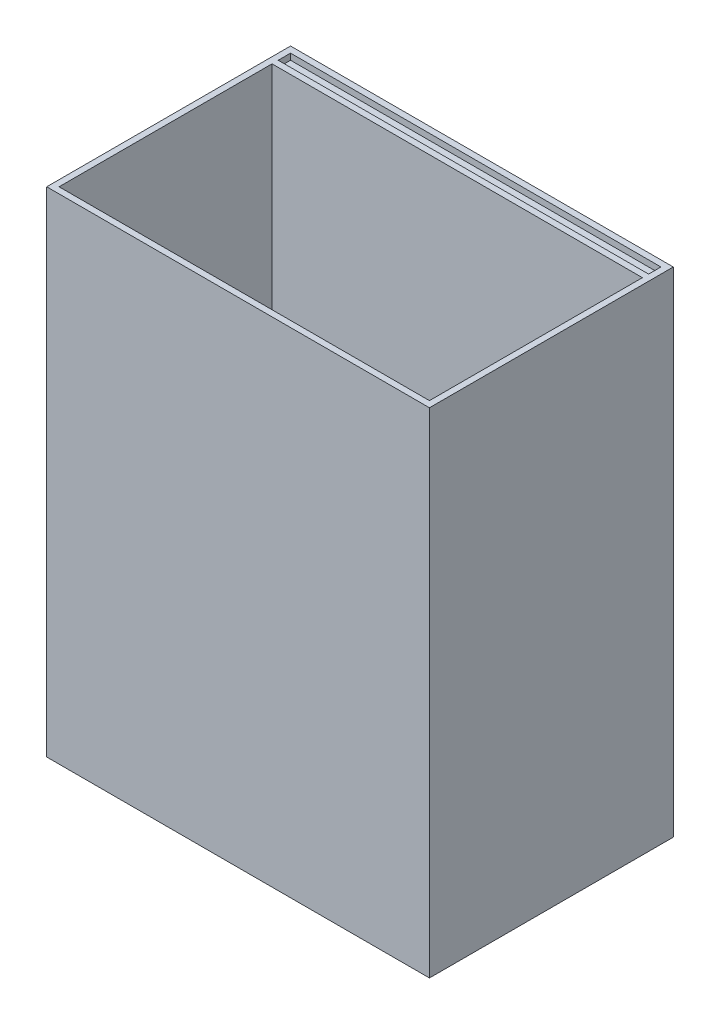
ISO-10303-21;
HEADER;
FILE_DESCRIPTION(('STEP AP214'),'2;1');
FILE_NAME('part.step','',(''),(''),'','','');
FILE_SCHEMA(('AUTOMOTIVE_DESIGN { 1 0 10303 214 1 1 1 1 }'));
ENDSEC;
DATA;
#1=APPLICATION_CONTEXT('core data for automotive mechanical design processes');
#2=APPLICATION_PROTOCOL_DEFINITION('international standard','automotive_design',2000,#1);
#3=PRODUCT_CONTEXT('',#1,'mechanical');
#4=PRODUCT('Part','Part','',(#3));
#5=PRODUCT_RELATED_PRODUCT_CATEGORY('part','',(#4));
#6=PRODUCT_DEFINITION_FORMATION('','',#4);
#7=PRODUCT_DEFINITION_CONTEXT('part definition',#1,'design');
#8=PRODUCT_DEFINITION('design','',#6,#7);
#9=PRODUCT_DEFINITION_SHAPE('','',#8);
#10=(LENGTH_UNIT() NAMED_UNIT(*) SI_UNIT(.MILLI.,.METRE.));
#11=(NAMED_UNIT(*) PLANE_ANGLE_UNIT() SI_UNIT($,.RADIAN.));
#12=(NAMED_UNIT(*) SI_UNIT($,.STERADIAN.) SOLID_ANGLE_UNIT());
#13=UNCERTAINTY_MEASURE_WITH_UNIT(LENGTH_MEASURE(1.E-05),#10,'distance_accuracy_value','');
#14=(GEOMETRIC_REPRESENTATION_CONTEXT(3) GLOBAL_UNCERTAINTY_ASSIGNED_CONTEXT((#13)) GLOBAL_UNIT_ASSIGNED_CONTEXT((#10,
#11,#12)) REPRESENTATION_CONTEXT('',''));
#15=CARTESIAN_POINT('',(0.,0.,0.));
#16=DIRECTION('',(0.,0.,1.));
#17=DIRECTION('',(1.,0.,0.));
#18=AXIS2_PLACEMENT_3D('',#15,#16,#17);
#19=CARTESIAN_POINT('',(6100.,0.,0.));
#20=DIRECTION('',(-1.,0.,0.));
#21=DIRECTION('',(0.,0.,1.));
#22=AXIS2_PLACEMENT_3D('',#19,#20,#21);
#23=PLANE('',#22);
#24=DIRECTION('',(0.,0.,-1.));
#25=VECTOR('',#24,1.);
#26=CARTESIAN_POINT('',(6100.,7900.,0.));
#27=LINE('',#26,#25);
#28=CARTESIAN_POINT('',(6100.,7900.,300.));
#29=VERTEX_POINT('',#28);
#30=CARTESIAN_POINT('',(6100.,7900.,100.));
#31=VERTEX_POINT('',#30);
#32=EDGE_CURVE('E370',#29,#31,#27,.T.);
#33=ORIENTED_EDGE('',*,*,#32,.F.);
#34=DIRECTION('',(0.,-1.,0.));
#35=VECTOR('',#34,1.);
#36=CARTESIAN_POINT('',(6100.,1600.,300.));
#37=LINE('',#36,#35);
#38=CARTESIAN_POINT('',(6100.,8000.,300.));
#39=VERTEX_POINT('',#38);
#40=EDGE_CURVE('E292',#39,#29,#37,.T.);
#41=ORIENTED_EDGE('',*,*,#40,.F.);
#42=DIRECTION('',(0.,0.,1.));
#43=VECTOR('',#42,1.);
#44=CARTESIAN_POINT('',(6100.,8000.,3850.));
#45=LINE('',#44,#43);
#46=CARTESIAN_POINT('',(6100.,8000.,100.));
#47=VERTEX_POINT('',#46);
#48=EDGE_CURVE('E485',#47,#39,#45,.T.);
#49=ORIENTED_EDGE('',*,*,#48,.F.);
#50=DIRECTION('',(0.,1.,0.));
#51=VECTOR('',#50,1.);
#52=CARTESIAN_POINT('',(6100.,100.,100.));
#53=LINE('',#52,#51);
#54=EDGE_CURVE('E478',#31,#47,#53,.T.);
#55=ORIENTED_EDGE('',*,*,#54,.F.);
#56=EDGE_LOOP('',(#33,#41,#49,#55));
#57=FACE_BOUND('',#56,.T.);
#58=ADVANCED_FACE('F43',(#57),#23,.T.);
#59=CARTESIAN_POINT('',(100.,0.,0.));
#60=DIRECTION('',(1.,0.,0.));
#61=DIRECTION('',(0.,0.,-1.));
#62=AXIS2_PLACEMENT_3D('',#59,#60,#61);
#63=PLANE('',#62);
#64=DIRECTION('',(0.,0.,1.));
#65=VECTOR('',#64,1.);
#66=CARTESIAN_POINT('',(100.,7900.,0.));
#67=LINE('',#66,#65);
#68=CARTESIAN_POINT('',(100.,7900.,100.));
#69=VERTEX_POINT('',#68);
#70=CARTESIAN_POINT('',(100.,7900.,300.));
#71=VERTEX_POINT('',#70);
#72=EDGE_CURVE('E366',#69,#71,#67,.T.);
#73=ORIENTED_EDGE('',*,*,#72,.F.);
#74=DIRECTION('',(0.,-1.,0.));
#75=VECTOR('',#74,1.);
#76=CARTESIAN_POINT('',(100.,100.,100.));
#77=LINE('',#76,#75);
#78=CARTESIAN_POINT('',(100.,8000.,100.));
#79=VERTEX_POINT('',#78);
#80=EDGE_CURVE('E447',#79,#69,#77,.T.);
#81=ORIENTED_EDGE('',*,*,#80,.F.);
#82=DIRECTION('',(0.,0.,-1.));
#83=VECTOR('',#82,1.);
#84=CARTESIAN_POINT('',(100.,8000.,100.));
#85=LINE('',#84,#83);
#86=CARTESIAN_POINT('',(100.,8000.,300.));
#87=VERTEX_POINT('',#86);
#88=EDGE_CURVE('E463',#87,#79,#85,.T.);
#89=ORIENTED_EDGE('',*,*,#88,.F.);
#90=DIRECTION('',(0.,1.,0.));
#91=VECTOR('',#90,1.);
#92=CARTESIAN_POINT('',(100.,0.,300.));
#93=LINE('',#92,#91);
#94=EDGE_CURVE('E549',#71,#87,#93,.T.);
#95=ORIENTED_EDGE('',*,*,#94,.F.);
#96=EDGE_LOOP('',(#73,#81,#89,#95));
#97=FACE_BOUND('',#96,.T.);
#98=ADVANCED_FACE('F635',(#97),#63,.T.);
#99=CARTESIAN_POINT('',(0.,0.,100.));
#100=DIRECTION('',(0.,0.,-1.));
#101=DIRECTION('',(-1.,0.,0.));
#102=AXIS2_PLACEMENT_3D('',#99,#100,#101);
#103=PLANE('',#102);
#104=ORIENTED_EDGE('',*,*,#80,.T.);
#105=DIRECTION('',(1.,0.,0.));
#106=VECTOR('',#105,1.);
#107=CARTESIAN_POINT('',(0.,7900.,100.));
#108=LINE('',#107,#106);
#109=EDGE_CURVE('E363',#69,#31,#108,.T.);
#110=ORIENTED_EDGE('',*,*,#109,.T.);
#111=ORIENTED_EDGE('',*,*,#54,.T.);
#112=DIRECTION('',(-1.,0.,0.));
#113=VECTOR('',#112,1.);
#114=CARTESIAN_POINT('',(0.,8000.,100.));
#115=LINE('',#114,#113);
#116=EDGE_CURVE('E514',#47,#79,#115,.T.);
#117=ORIENTED_EDGE('',*,*,#116,.T.);
#118=EDGE_LOOP('',(#104,#110,#111,#117));
#119=FACE_BOUND('',#118,.T.);
#120=ADVANCED_FACE('F624',(#119),#103,.F.);
#121=CARTESIAN_POINT('',(0.,0.,300.));
#122=DIRECTION('',(0.,0.,-1.));
#123=DIRECTION('',(-1.,0.,0.));
#124=AXIS2_PLACEMENT_3D('',#121,#122,#123);
#125=PLANE('',#124);
#126=DIRECTION('',(1.,0.,0.));
#127=VECTOR('',#126,1.);
#128=CARTESIAN_POINT('',(0.,7900.,300.));
#129=LINE('',#128,#127);
#130=EDGE_CURVE('E581',#71,#29,#129,.T.);
#131=ORIENTED_EDGE('',*,*,#130,.F.);
#132=ORIENTED_EDGE('',*,*,#94,.T.);
#133=DIRECTION('',(-1.,0.,0.));
#134=VECTOR('',#133,1.);
#135=CARTESIAN_POINT('',(100.,8000.,300.));
#136=LINE('',#135,#134);
#137=EDGE_CURVE('E419',#39,#87,#136,.T.);
#138=ORIENTED_EDGE('',*,*,#137,.F.);
#139=ORIENTED_EDGE('',*,*,#40,.T.);
#140=EDGE_LOOP('',(#131,#132,#138,#139));
#141=FACE_BOUND('',#140,.T.);
#142=ADVANCED_FACE('F638',(#141),#125,.T.);
#143=CARTESIAN_POINT('',(6100.,8000.,400.));
#144=VERTEX_POINT('',#143);
#145=CARTESIAN_POINT('',(6100.,8000.,3850.));
#146=VERTEX_POINT('',#145);
#147=EDGE_CURVE('E483',#144,#146,#45,.T.);
#148=ORIENTED_EDGE('',*,*,#147,.F.);
#149=DIRECTION('',(0.,-1.,0.));
#150=VECTOR('',#149,1.);
#151=CARTESIAN_POINT('',(6100.,8000.,400.));
#152=LINE('',#151,#150);
#153=CARTESIAN_POINT('',(6100.,1600.,400.));
#154=VERTEX_POINT('',#153);
#155=EDGE_CURVE('E423',#144,#154,#152,.T.);
#156=ORIENTED_EDGE('',*,*,#155,.T.);
#157=DIRECTION('',(0.,0.,1.));
#158=VECTOR('',#157,1.);
#159=CARTESIAN_POINT('',(6100.,1600.,300.));
#160=LINE('',#159,#158);
#161=CARTESIAN_POINT('',(6100.,1600.,3850.));
#162=VERTEX_POINT('',#161);
#163=EDGE_CURVE('E309',#154,#162,#160,.T.);
#164=ORIENTED_EDGE('',*,*,#163,.T.);
#165=DIRECTION('',(0.,-1.,0.));
#166=VECTOR('',#165,1.);
#167=CARTESIAN_POINT('',(6100.,100.,3850.));
#168=LINE('',#167,#166);
#169=EDGE_CURVE('E469',#146,#162,#168,.T.);
#170=ORIENTED_EDGE('',*,*,#169,.F.);
#171=EDGE_LOOP('',(#148,#156,#164,#170));
#172=FACE_BOUND('',#171,.T.);
#173=ADVANCED_FACE('F747',(#172),#23,.T.);
#174=DIRECTION('',(0.,0.,-1.));
#175=VECTOR('',#174,1.);
#176=CARTESIAN_POINT('',(100.,1600.,0.));
#177=LINE('',#176,#175);
#178=CARTESIAN_POINT('',(100.,1600.,3850.));
#179=VERTEX_POINT('',#178);
#180=CARTESIAN_POINT('',(99.9999999999997,1600.,400.));
#181=VERTEX_POINT('',#180);
#182=EDGE_CURVE('E552',#179,#181,#177,.T.);
#183=ORIENTED_EDGE('',*,*,#182,.T.);
#184=DIRECTION('',(0.,-1.,0.));
#185=VECTOR('',#184,1.);
#186=CARTESIAN_POINT('',(100.,8000.,400.));
#187=LINE('',#186,#185);
#188=CARTESIAN_POINT('',(100.,8000.,400.));
#189=VERTEX_POINT('',#188);
#190=EDGE_CURVE('E428',#189,#181,#187,.T.);
#191=ORIENTED_EDGE('',*,*,#190,.F.);
#192=CARTESIAN_POINT('',(100.,8000.,3850.));
#193=VERTEX_POINT('',#192);
#194=EDGE_CURVE('E464',#193,#189,#85,.T.);
#195=ORIENTED_EDGE('',*,*,#194,.F.);
#196=DIRECTION('',(0.,1.,0.));
#197=VECTOR('',#196,1.);
#198=CARTESIAN_POINT('',(100.,100.,3850.));
#199=LINE('',#198,#197);
#200=EDGE_CURVE('E457',#179,#193,#199,.T.);
#201=ORIENTED_EDGE('',*,*,#200,.F.);
#202=EDGE_LOOP('',(#183,#191,#195,#201));
#203=FACE_BOUND('',#202,.T.);
#204=ADVANCED_FACE('F740',(#203),#63,.T.);
#205=CARTESIAN_POINT('',(6100.,1600.,300.));
#206=DIRECTION('',(0.,-1.,0.));
#207=DIRECTION('',(1.,0.,0.));
#208=AXIS2_PLACEMENT_3D('',#205,#206,#207);
#209=PLANE('',#208);
#210=DIRECTION('',(1.,0.,0.));
#211=VECTOR('',#210,1.);
#212=CARTESIAN_POINT('',(99.9999999999997,1600.,400.));
#213=LINE('',#212,#211);
#214=EDGE_CURVE('E415',#181,#154,#213,.T.);
#215=ORIENTED_EDGE('',*,*,#214,.F.);
#216=ORIENTED_EDGE('',*,*,#182,.F.);
#217=DIRECTION('',(1.,0.,0.));
#218=VECTOR('',#217,1.);
#219=CARTESIAN_POINT('',(6100.,1600.,3850.));
#220=LINE('',#219,#218);
#221=EDGE_CURVE('E290',#179,#162,#220,.T.);
#222=ORIENTED_EDGE('',*,*,#221,.T.);
#223=ORIENTED_EDGE('',*,*,#163,.F.);
#224=EDGE_LOOP('',(#215,#216,#222,#223));
#225=FACE_BOUND('',#224,.T.);
#226=ADVANCED_FACE('F732',(#225),#209,.F.);
#227=CARTESIAN_POINT('',(0.,0.,3850.));
#228=DIRECTION('',(0.,0.,-1.));
#229=DIRECTION('',(-1.,0.,0.));
#230=AXIS2_PLACEMENT_3D('',#227,#228,#229);
#231=PLANE('',#230);
#232=ORIENTED_EDGE('',*,*,#169,.T.);
#233=ORIENTED_EDGE('',*,*,#221,.F.);
#234=ORIENTED_EDGE('',*,*,#200,.T.);
#235=DIRECTION('',(-1.,0.,0.));
#236=VECTOR('',#235,1.);
#237=CARTESIAN_POINT('',(0.,8000.,3850.));
#238=LINE('',#237,#236);
#239=EDGE_CURVE('E490',#146,#193,#238,.T.);
#240=ORIENTED_EDGE('',*,*,#239,.F.);
#241=EDGE_LOOP('',(#232,#233,#234,#240));
#242=FACE_BOUND('',#241,.T.);
#243=ADVANCED_FACE('F725',(#242),#231,.T.);
#244=CARTESIAN_POINT('',(0.,0.,100.));
#245=DIRECTION('',(1.,0.,0.));
#246=DIRECTION('',(0.,0.,-1.));
#247=AXIS2_PLACEMENT_3D('',#244,#245,#246);
#248=PLANE('',#247);
#249=DIRECTION('',(0.,-1.,0.));
#250=VECTOR('',#249,1.);
#251=CARTESIAN_POINT('',(0.,0.,0.));
#252=LINE('',#251,#250);
#253=CARTESIAN_POINT('',(0.,8000.,0.));
#254=VERTEX_POINT('',#253);
#255=CARTESIAN_POINT('',(0.,0.,0.));
#256=VERTEX_POINT('',#255);
#257=EDGE_CURVE('E510',#254,#256,#252,.T.);
#258=ORIENTED_EDGE('',*,*,#257,.T.);
#259=DIRECTION('',(0.,0.,-1.));
#260=VECTOR('',#259,1.);
#261=CARTESIAN_POINT('',(0.,0.,100.));
#262=LINE('',#261,#260);
#263=CARTESIAN_POINT('',(0.,0.,3950.));
#264=VERTEX_POINT('',#263);
#265=EDGE_CURVE('E541',#264,#256,#262,.T.);
#266=ORIENTED_EDGE('',*,*,#265,.F.);
#267=DIRECTION('',(0.,-1.,0.));
#268=VECTOR('',#267,1.);
#269=CARTESIAN_POINT('',(0.,0.,3950.));
#270=LINE('',#269,#268);
#271=CARTESIAN_POINT('',(0.,8000.,3950.));
#272=VERTEX_POINT('',#271);
#273=EDGE_CURVE('E498',#272,#264,#270,.T.);
#274=ORIENTED_EDGE('',*,*,#273,.F.);
#275=DIRECTION('',(0.,0.,-1.));
#276=VECTOR('',#275,1.);
#277=CARTESIAN_POINT('',(0.,8000.,100.));
#278=LINE('',#277,#276);
#279=EDGE_CURVE('E518',#272,#254,#278,.T.);
#280=ORIENTED_EDGE('',*,*,#279,.T.);
#281=EDGE_LOOP('',(#258,#266,#274,#280));
#282=FACE_BOUND('',#281,.T.);
#283=ADVANCED_FACE('F45',(#282),#248,.F.);
#284=CARTESIAN_POINT('',(0.,0.,100.));
#285=DIRECTION('',(0.,1.,0.));
#286=DIRECTION('',(0.,0.,1.));
#287=AXIS2_PLACEMENT_3D('',#284,#285,#286);
#288=PLANE('',#287);
#289=DIRECTION('',(1.,0.,0.));
#290=VECTOR('',#289,1.);
#291=CARTESIAN_POINT('',(0.,0.,0.));
#292=LINE('',#291,#290);
#293=CARTESIAN_POINT('',(6200.,0.,0.));
#294=VERTEX_POINT('',#293);
#295=EDGE_CURVE('E522',#256,#294,#292,.T.);
#296=ORIENTED_EDGE('',*,*,#295,.T.);
#297=DIRECTION('',(0.,0.,-1.));
#298=VECTOR('',#297,1.);
#299=CARTESIAN_POINT('',(6200.,0.,100.));
#300=LINE('',#299,#298);
#301=CARTESIAN_POINT('',(6200.,0.,3950.));
#302=VERTEX_POINT('',#301);
#303=EDGE_CURVE('E538',#302,#294,#300,.T.);
#304=ORIENTED_EDGE('',*,*,#303,.F.);
#305=DIRECTION('',(1.,0.,0.));
#306=VECTOR('',#305,1.);
#307=CARTESIAN_POINT('',(0.,0.,3950.));
#308=LINE('',#307,#306);
#309=EDGE_CURVE('E502',#264,#302,#308,.T.);
#310=ORIENTED_EDGE('',*,*,#309,.F.);
#311=ORIENTED_EDGE('',*,*,#265,.T.);
#312=EDGE_LOOP('',(#296,#304,#310,#311));
#313=FACE_BOUND('',#312,.T.);
#314=ADVANCED_FACE('F738',(#313),#288,.F.);
#315=CARTESIAN_POINT('',(6200.,0.,100.));
#316=DIRECTION('',(-1.,0.,0.));
#317=DIRECTION('',(0.,0.,1.));
#318=AXIS2_PLACEMENT_3D('',#315,#316,#317);
#319=PLANE('',#318);
#320=DIRECTION('',(0.,1.,0.));
#321=VECTOR('',#320,1.);
#322=CARTESIAN_POINT('',(6200.,0.,0.));
#323=LINE('',#322,#321);
#324=CARTESIAN_POINT('',(6200.,8000.,0.));
#325=VERTEX_POINT('',#324);
#326=EDGE_CURVE('E526',#294,#325,#323,.T.);
#327=ORIENTED_EDGE('',*,*,#326,.T.);
#328=DIRECTION('',(0.,0.,-1.));
#329=VECTOR('',#328,1.);
#330=CARTESIAN_POINT('',(6200.,8000.,100.));
#331=LINE('',#330,#329);
#332=CARTESIAN_POINT('',(6200.,8000.,3950.));
#333=VERTEX_POINT('',#332);
#334=EDGE_CURVE('E534',#333,#325,#331,.T.);
#335=ORIENTED_EDGE('',*,*,#334,.F.);
#336=DIRECTION('',(0.,1.,0.));
#337=VECTOR('',#336,1.);
#338=CARTESIAN_POINT('',(6200.,0.,3950.));
#339=LINE('',#338,#337);
#340=EDGE_CURVE('E506',#302,#333,#339,.T.);
#341=ORIENTED_EDGE('',*,*,#340,.F.);
#342=ORIENTED_EDGE('',*,*,#303,.T.);
#343=EDGE_LOOP('',(#327,#335,#341,#342));
#344=FACE_BOUND('',#343,.T.);
#345=ADVANCED_FACE('F852',(#344),#319,.F.);
#346=CARTESIAN_POINT('',(0.,8000.,100.));
#347=DIRECTION('',(0.,-1.,0.));
#348=DIRECTION('',(0.,0.,-1.));
#349=AXIS2_PLACEMENT_3D('',#346,#347,#348);
#350=PLANE('',#349);
#351=ORIENTED_EDGE('',*,*,#194,.T.);
#352=DIRECTION('',(1.,0.,0.));
#353=VECTOR('',#352,1.);
#354=CARTESIAN_POINT('',(100.,8000.,400.));
#355=LINE('',#354,#353);
#356=EDGE_CURVE('E416',#189,#144,#355,.T.);
#357=ORIENTED_EDGE('',*,*,#356,.T.);
#358=ORIENTED_EDGE('',*,*,#147,.T.);
#359=ORIENTED_EDGE('',*,*,#239,.T.);
#360=EDGE_LOOP('',(#351,#357,#358,#359));
#361=FACE_BOUND('',#360,.T.);
#362=ORIENTED_EDGE('',*,*,#279,.F.);
#363=DIRECTION('',(-1.,0.,0.));
#364=VECTOR('',#363,1.);
#365=CARTESIAN_POINT('',(0.,8000.,3950.));
#366=LINE('',#365,#364);
#367=EDGE_CURVE('E489',#333,#272,#366,.T.);
#368=ORIENTED_EDGE('',*,*,#367,.F.);
#369=ORIENTED_EDGE('',*,*,#334,.T.);
#370=DIRECTION('',(-1.,0.,0.));
#371=VECTOR('',#370,1.);
#372=CARTESIAN_POINT('',(0.,8000.,0.));
#373=LINE('',#372,#371);
#374=EDGE_CURVE('E519',#325,#254,#373,.T.);
#375=ORIENTED_EDGE('',*,*,#374,.T.);
#376=EDGE_LOOP('',(#362,#368,#369,#375));
#377=FACE_BOUND('',#376,.T.);
#378=ORIENTED_EDGE('',*,*,#137,.T.);
#379=ORIENTED_EDGE('',*,*,#88,.T.);
#380=ORIENTED_EDGE('',*,*,#116,.F.);
#381=ORIENTED_EDGE('',*,*,#48,.T.);
#382=EDGE_LOOP('',(#378,#379,#380,#381));
#383=FACE_BOUND('',#382,.T.);
#384=ADVANCED_FACE('F629',(#361,#377,#383),#350,.F.);
#385=CARTESIAN_POINT('',(0.,0.,0.));
#386=DIRECTION('',(0.,0.,-1.));
#387=DIRECTION('',(-1.,0.,0.));
#388=AXIS2_PLACEMENT_3D('',#385,#386,#387);
#389=PLANE('',#388);
#390=ORIENTED_EDGE('',*,*,#295,.F.);
#391=ORIENTED_EDGE('',*,*,#257,.F.);
#392=ORIENTED_EDGE('',*,*,#374,.F.);
#393=ORIENTED_EDGE('',*,*,#326,.F.);
#394=EDGE_LOOP('',(#390,#391,#392,#393));
#395=FACE_BOUND('',#394,.T.);
#396=ADVANCED_FACE('F839',(#395),#389,.T.);
#397=CARTESIAN_POINT('',(0.,0.,3950.));
#398=DIRECTION('',(0.,0.,-1.));
#399=DIRECTION('',(-1.,0.,0.));
#400=AXIS2_PLACEMENT_3D('',#397,#398,#399);
#401=PLANE('',#400);
#402=ORIENTED_EDGE('',*,*,#273,.T.);
#403=ORIENTED_EDGE('',*,*,#309,.T.);
#404=ORIENTED_EDGE('',*,*,#340,.T.);
#405=ORIENTED_EDGE('',*,*,#367,.T.);
#406=EDGE_LOOP('',(#402,#403,#404,#405));
#407=FACE_BOUND('',#406,.T.);
#408=ADVANCED_FACE('F833',(#407),#401,.F.);
#409=CARTESIAN_POINT('',(100.,8000.,400.));
#410=DIRECTION('',(0.,0.,-1.));
#411=DIRECTION('',(-1.,0.,0.));
#412=AXIS2_PLACEMENT_3D('',#409,#410,#411);
#413=PLANE('',#412);
#414=ORIENTED_EDGE('',*,*,#214,.T.);
#415=ORIENTED_EDGE('',*,*,#155,.F.);
#416=ORIENTED_EDGE('',*,*,#356,.F.);
#417=ORIENTED_EDGE('',*,*,#190,.T.);
#418=EDGE_LOOP('',(#414,#415,#416,#417));
#419=FACE_BOUND('',#418,.T.);
#420=ADVANCED_FACE('F831',(#419),#413,.F.);
#421=CARTESIAN_POINT('',(6200.,7900.,300.));
#422=DIRECTION('',(0.,1.,0.));
#423=DIRECTION('',(0.,0.,1.));
#424=AXIS2_PLACEMENT_3D('',#421,#422,#423);
#425=PLANE('',#424);
#426=ORIENTED_EDGE('',*,*,#130,.T.);
#427=ORIENTED_EDGE('',*,*,#32,.T.);
#428=ORIENTED_EDGE('',*,*,#109,.F.);
#429=ORIENTED_EDGE('',*,*,#72,.T.);
#430=EDGE_LOOP('',(#426,#427,#428,#429));
#431=FACE_BOUND('',#430,.T.);
#432=ADVANCED_FACE('F637',(#431),#425,.T.);
#433=CLOSED_SHELL('',(#58,#98,#120,#142,#173,#204,#226,#243,#283,#314,#345,#384,#396,#408,#420,#432));
#434=CARTESIAN_POINT('',(6200.,5700.,300.));
#435=DIRECTION('',(0.,-1.,0.));
#436=DIRECTION('',(0.,0.,-1.));
#437=AXIS2_PLACEMENT_3D('',#434,#435,#436);
#438=PLANE('',#437);
#439=DIRECTION('',(-1.,0.,0.));
#440=VECTOR('',#439,1.);
#441=CARTESIAN_POINT('',(6200.,5700.,300.));
#442=LINE('',#441,#440);
#443=CARTESIAN_POINT('',(6100.,5700.,300.));
#444=VERTEX_POINT('',#443);
#445=CARTESIAN_POINT('',(100.,5700.,300.));
#446=VERTEX_POINT('',#445);
#447=EDGE_CURVE('E330',#444,#446,#442,.T.);
#448=ORIENTED_EDGE('',*,*,#447,.T.);
#449=DIRECTION('',(0.,0.,-1.));
#450=VECTOR('',#449,1.);
#451=CARTESIAN_POINT('',(100.,5700.,0.));
#452=LINE('',#451,#450);
#453=CARTESIAN_POINT('',(100.,5700.,100.));
#454=VERTEX_POINT('',#453);
#455=EDGE_CURVE('E343',#446,#454,#452,.T.);
#456=ORIENTED_EDGE('',*,*,#455,.T.);
#457=DIRECTION('',(-1.,0.,0.));
#458=VECTOR('',#457,1.);
#459=CARTESIAN_POINT('',(0.,5700.,100.));
#460=LINE('',#459,#458);
#461=CARTESIAN_POINT('',(6100.,5700.,100.));
#462=VERTEX_POINT('',#461);
#463=EDGE_CURVE('E336',#462,#454,#460,.T.);
#464=ORIENTED_EDGE('',*,*,#463,.F.);
#465=DIRECTION('',(0.,0.,1.));
#466=VECTOR('',#465,1.);
#467=CARTESIAN_POINT('',(6100.,5700.,0.));
#468=LINE('',#467,#466);
#469=EDGE_CURVE('E585',#462,#444,#468,.T.);
#470=ORIENTED_EDGE('',*,*,#469,.T.);
#471=EDGE_LOOP('',(#448,#456,#464,#470));
#472=FACE_BOUND('',#471,.T.);
#473=ADVANCED_FACE('F654',(#472),#438,.T.);
#474=CARTESIAN_POINT('',(100.,5200.,100.));
#475=VERTEX_POINT('',#474);
#476=EDGE_CURVE('E600',#454,#475,#77,.T.);
#477=ORIENTED_EDGE('',*,*,#476,.T.);
#478=DIRECTION('',(1.,0.,0.));
#479=VECTOR('',#478,1.);
#480=CARTESIAN_POINT('',(0.,5200.,100.));
#481=LINE('',#480,#479);
#482=CARTESIAN_POINT('',(6100.,5200.,100.));
#483=VERTEX_POINT('',#482);
#484=EDGE_CURVE('E11',#475,#483,#481,.T.);
#485=ORIENTED_EDGE('',*,*,#484,.T.);
#486=EDGE_CURVE('E484',#483,#462,#53,.T.);
#487=ORIENTED_EDGE('',*,*,#486,.T.);
#488=ORIENTED_EDGE('',*,*,#463,.T.);
#489=EDGE_LOOP('',(#477,#485,#487,#488));
#490=FACE_BOUND('',#489,.T.);
#491=ADVANCED_FACE('F665',(#490),#103,.F.);
#492=DIRECTION('',(1.,0.,0.));
#493=VECTOR('',#492,1.);
#494=CARTESIAN_POINT('',(6200.,5200.,300.));
#495=LINE('',#494,#493);
#496=CARTESIAN_POINT('',(99.9999999999996,5200.,300.));
#497=VERTEX_POINT('',#496);
#498=CARTESIAN_POINT('',(6100.,5200.,300.));
#499=VERTEX_POINT('',#498);
#500=EDGE_CURVE('E281',#497,#499,#495,.T.);
#501=ORIENTED_EDGE('',*,*,#500,.F.);
#502=EDGE_CURVE('E553',#497,#446,#93,.T.);
#503=ORIENTED_EDGE('',*,*,#502,.T.);
#504=ORIENTED_EDGE('',*,*,#447,.F.);
#505=EDGE_CURVE('E289',#444,#499,#37,.T.);
#506=ORIENTED_EDGE('',*,*,#505,.T.);
#507=EDGE_LOOP('',(#501,#503,#504,#506));
#508=FACE_BOUND('',#507,.T.);
#509=ADVANCED_FACE('F648',(#508),#125,.T.);
#510=DIRECTION('',(0.,0.,-1.));
#511=VECTOR('',#510,1.);
#512=CARTESIAN_POINT('',(6100.,5200.,0.));
#513=LINE('',#512,#511);
#514=EDGE_CURVE('E68',#499,#483,#513,.T.);
#515=ORIENTED_EDGE('',*,*,#514,.F.);
#516=ORIENTED_EDGE('',*,*,#505,.F.);
#517=ORIENTED_EDGE('',*,*,#469,.F.);
#518=ORIENTED_EDGE('',*,*,#486,.F.);
#519=EDGE_LOOP('',(#515,#516,#517,#518));
#520=FACE_BOUND('',#519,.T.);
#521=ADVANCED_FACE('F658',(#520),#23,.T.);
#522=DIRECTION('',(0.,0.,1.));
#523=VECTOR('',#522,1.);
#524=CARTESIAN_POINT('',(100.,5200.,0.));
#525=LINE('',#524,#523);
#526=EDGE_CURVE('E331',#475,#497,#525,.T.);
#527=ORIENTED_EDGE('',*,*,#526,.F.);
#528=ORIENTED_EDGE('',*,*,#476,.F.);
#529=ORIENTED_EDGE('',*,*,#455,.F.);
#530=ORIENTED_EDGE('',*,*,#502,.F.);
#531=EDGE_LOOP('',(#527,#528,#529,#530));
#532=FACE_BOUND('',#531,.T.);
#533=ADVANCED_FACE('F651',(#532),#63,.T.);
#534=CARTESIAN_POINT('',(6200.,5200.,300.));
#535=DIRECTION('',(0.,1.,0.));
#536=DIRECTION('',(0.,0.,1.));
#537=AXIS2_PLACEMENT_3D('',#534,#535,#536);
#538=PLANE('',#537);
#539=ORIENTED_EDGE('',*,*,#484,.F.);
#540=ORIENTED_EDGE('',*,*,#526,.T.);
#541=ORIENTED_EDGE('',*,*,#500,.T.);
#542=ORIENTED_EDGE('',*,*,#514,.T.);
#543=EDGE_LOOP('',(#539,#540,#541,#542));
#544=FACE_BOUND('',#543,.T.);
#545=ADVANCED_FACE('F664',(#544),#538,.T.);
#546=CLOSED_SHELL('',(#473,#491,#509,#521,#533,#545));
#547=CARTESIAN_POINT('',(6100.,1401.72309910255,300.));
#548=DIRECTION('',(0.,1.,0.));
#549=DIRECTION('',(0.,0.,1.));
#550=AXIS2_PLACEMENT_3D('',#547,#548,#549);
#551=PLANE('',#550);
#552=DIRECTION('',(0.,0.,1.));
#553=VECTOR('',#552,1.);
#554=CARTESIAN_POINT('',(6100.,1401.72309910255,300.));
#555=LINE('',#554,#553);
#556=CARTESIAN_POINT('',(6100.,1401.72309910255,300.));
#557=VERTEX_POINT('',#556);
#558=CARTESIAN_POINT('',(6100.,1401.72309910255,375.));
#559=VERTEX_POINT('',#558);
#560=EDGE_CURVE('E286',#557,#559,#555,.T.);
#561=ORIENTED_EDGE('',*,*,#560,.T.);
#562=DIRECTION('',(-1.,0.,0.));
#563=VECTOR('',#562,1.);
#564=CARTESIAN_POINT('',(6100.,1401.72309910255,375.));
#565=LINE('',#564,#563);
#566=CARTESIAN_POINT('',(100.,1401.72309910255,375.));
#567=VERTEX_POINT('',#566);
#568=EDGE_CURVE('E571',#559,#567,#565,.T.);
#569=ORIENTED_EDGE('',*,*,#568,.T.);
#570=DIRECTION('',(0.,0.,1.));
#571=VECTOR('',#570,1.);
#572=CARTESIAN_POINT('',(100.,1401.72309910255,0.));
#573=LINE('',#572,#571);
#574=CARTESIAN_POINT('',(100.,1401.72309910255,300.));
#575=VERTEX_POINT('',#574);
#576=EDGE_CURVE('E558',#575,#567,#573,.T.);
#577=ORIENTED_EDGE('',*,*,#576,.F.);
#578=DIRECTION('',(-1.,0.,0.));
#579=VECTOR('',#578,1.);
#580=CARTESIAN_POINT('',(6100.,1401.72309910255,300.));
#581=LINE('',#580,#579);
#582=EDGE_CURVE('E303',#557,#575,#581,.T.);
#583=ORIENTED_EDGE('',*,*,#582,.F.);
#584=EDGE_LOOP('',(#561,#569,#577,#583));
#585=FACE_BOUND('',#584,.T.);
#586=ADVANCED_FACE('F686',(#585),#551,.F.);
#587=CARTESIAN_POINT('',(0.,1500.,375.));
#588=DIRECTION('',(0.,0.,-1.));
#589=DIRECTION('',(-1.,0.,0.));
#590=AXIS2_PLACEMENT_3D('',#587,#588,#589);
#591=PLANE('',#590);
#592=DIRECTION('',(1.,0.,0.));
#593=VECTOR('',#592,1.);
#594=CARTESIAN_POINT('',(0.,100.,375.));
#595=LINE('',#594,#593);
#596=CARTESIAN_POINT('',(100.,100.,375.));
#597=VERTEX_POINT('',#596);
#598=CARTESIAN_POINT('',(6100.,100.,375.));
#599=VERTEX_POINT('',#598);
#600=EDGE_CURVE('E380',#597,#599,#595,.T.);
#601=ORIENTED_EDGE('',*,*,#600,.F.);
#602=DIRECTION('',(0.,1.,0.));
#603=VECTOR('',#602,1.);
#604=CARTESIAN_POINT('',(100.,0.,375.));
#605=LINE('',#604,#603);
#606=EDGE_CURVE('E374',#597,#567,#605,.T.);
#607=ORIENTED_EDGE('',*,*,#606,.T.);
#608=ORIENTED_EDGE('',*,*,#568,.F.);
#609=DIRECTION('',(0.,-1.,0.));
#610=VECTOR('',#609,1.);
#611=CARTESIAN_POINT('',(6100.,0.,375.));
#612=LINE('',#611,#610);
#613=EDGE_CURVE('E377',#559,#599,#612,.T.);
#614=ORIENTED_EDGE('',*,*,#613,.T.);
#615=EDGE_LOOP('',(#601,#607,#608,#614));
#616=FACE_BOUND('',#615,.T.);
#617=ADVANCED_FACE('F688',(#616),#591,.T.);
#618=CARTESIAN_POINT('',(0.,100.,3950.));
#619=DIRECTION('',(0.,-1.,0.));
#620=DIRECTION('',(0.,0.,-1.));
#621=AXIS2_PLACEMENT_3D('',#618,#619,#620);
#622=PLANE('',#621);
#623=DIRECTION('',(0.,0.,1.));
#624=VECTOR('',#623,1.);
#625=CARTESIAN_POINT('',(100.,100.,100.));
#626=LINE('',#625,#624);
#627=CARTESIAN_POINT('',(100.,100.,100.));
#628=VERTEX_POINT('',#627);
#629=EDGE_CURVE('E453',#628,#597,#626,.T.);
#630=ORIENTED_EDGE('',*,*,#629,.T.);
#631=ORIENTED_EDGE('',*,*,#600,.T.);
#632=DIRECTION('',(0.,0.,-1.));
#633=VECTOR('',#632,1.);
#634=CARTESIAN_POINT('',(6100.,100.,3850.));
#635=LINE('',#634,#633);
#636=CARTESIAN_POINT('',(6100.,100.,100.));
#637=VERTEX_POINT('',#636);
#638=EDGE_CURVE('E473',#599,#637,#635,.T.);
#639=ORIENTED_EDGE('',*,*,#638,.T.);
#640=DIRECTION('',(-1.,0.,0.));
#641=VECTOR('',#640,1.);
#642=CARTESIAN_POINT('',(0.,100.,100.));
#643=LINE('',#642,#641);
#644=EDGE_CURVE('E494',#637,#628,#643,.T.);
#645=ORIENTED_EDGE('',*,*,#644,.T.);
#646=EDGE_LOOP('',(#630,#631,#639,#645));
#647=FACE_BOUND('',#646,.T.);
#648=ADVANCED_FACE('F697',(#647),#622,.F.);
#649=DIRECTION('',(0.,0.,-1.));
#650=VECTOR('',#649,1.);
#651=CARTESIAN_POINT('',(100.,5100.,0.));
#652=LINE('',#651,#650);
#653=CARTESIAN_POINT('',(99.9999999999996,5100.,300.));
#654=VERTEX_POINT('',#653);
#655=CARTESIAN_POINT('',(100.,5100.,100.));
#656=VERTEX_POINT('',#655);
#657=EDGE_CURVE('E60',#654,#656,#652,.T.);
#658=ORIENTED_EDGE('',*,*,#657,.F.);
#659=EDGE_CURVE('E279',#575,#654,#93,.T.);
#660=ORIENTED_EDGE('',*,*,#659,.F.);
#661=ORIENTED_EDGE('',*,*,#576,.T.);
#662=ORIENTED_EDGE('',*,*,#606,.F.);
#663=ORIENTED_EDGE('',*,*,#629,.F.);
#664=EDGE_CURVE('E445',#656,#628,#77,.T.);
#665=ORIENTED_EDGE('',*,*,#664,.F.);
#666=EDGE_LOOP('',(#658,#660,#661,#662,#663,#665));
#667=FACE_BOUND('',#666,.T.);
#668=ADVANCED_FACE('F597',(#667),#63,.T.);
#669=DIRECTION('',(0.,0.,1.));
#670=VECTOR('',#669,1.);
#671=CARTESIAN_POINT('',(6100.,5100.,0.));
#672=LINE('',#671,#670);
#673=CARTESIAN_POINT('',(6100.,5100.,100.));
#674=VERTEX_POINT('',#673);
#675=CARTESIAN_POINT('',(6100.,5100.,300.));
#676=VERTEX_POINT('',#675);
#677=EDGE_CURVE('E263',#674,#676,#672,.T.);
#678=ORIENTED_EDGE('',*,*,#677,.F.);
#679=EDGE_CURVE('E480',#637,#674,#53,.T.);
#680=ORIENTED_EDGE('',*,*,#679,.F.);
#681=ORIENTED_EDGE('',*,*,#638,.F.);
#682=ORIENTED_EDGE('',*,*,#613,.F.);
#683=ORIENTED_EDGE('',*,*,#560,.F.);
#684=EDGE_CURVE('E277',#676,#557,#37,.T.);
#685=ORIENTED_EDGE('',*,*,#684,.F.);
#686=EDGE_LOOP('',(#678,#680,#681,#682,#683,#685));
#687=FACE_BOUND('',#686,.T.);
#688=ADVANCED_FACE('F283',(#687),#23,.T.);
#689=DIRECTION('',(-1.,0.,0.));
#690=VECTOR('',#689,1.);
#691=CARTESIAN_POINT('',(6200.,5100.,300.));
#692=LINE('',#691,#690);
#693=EDGE_CURVE('E266',#676,#654,#692,.T.);
#694=ORIENTED_EDGE('',*,*,#693,.F.);
#695=ORIENTED_EDGE('',*,*,#684,.T.);
#696=ORIENTED_EDGE('',*,*,#582,.T.);
#697=ORIENTED_EDGE('',*,*,#659,.T.);
#698=EDGE_LOOP('',(#694,#695,#696,#697));
#699=FACE_BOUND('',#698,.T.);
#700=ADVANCED_FACE('F275',(#699),#125,.T.);
#701=ORIENTED_EDGE('',*,*,#679,.T.);
#702=DIRECTION('',(-1.,0.,0.));
#703=VECTOR('',#702,1.);
#704=CARTESIAN_POINT('',(0.,5100.,100.));
#705=LINE('',#704,#703);
#706=EDGE_CURVE('E53',#674,#656,#705,.T.);
#707=ORIENTED_EDGE('',*,*,#706,.T.);
#708=ORIENTED_EDGE('',*,*,#664,.T.);
#709=ORIENTED_EDGE('',*,*,#644,.F.);
#710=EDGE_LOOP('',(#701,#707,#708,#709));
#711=FACE_BOUND('',#710,.T.);
#712=ADVANCED_FACE('F593',(#711),#103,.F.);
#713=CARTESIAN_POINT('',(6200.,5100.,300.));
#714=DIRECTION('',(0.,-1.,0.));
#715=DIRECTION('',(0.,0.,-1.));
#716=AXIS2_PLACEMENT_3D('',#713,#714,#715);
#717=PLANE('',#716);
#718=ORIENTED_EDGE('',*,*,#693,.T.);
#719=ORIENTED_EDGE('',*,*,#657,.T.);
#720=ORIENTED_EDGE('',*,*,#706,.F.);
#721=ORIENTED_EDGE('',*,*,#677,.T.);
#722=EDGE_LOOP('',(#718,#719,#720,#721));
#723=FACE_BOUND('',#722,.T.);
#724=ADVANCED_FACE('F265',(#723),#717,.T.);
#725=CLOSED_SHELL('',(#586,#617,#648,#668,#688,#700,#712,#724));
#726=CARTESIAN_POINT('',(100.,7800.,100.));
#727=VERTEX_POINT('',#726);
#728=CARTESIAN_POINT('',(100.,5800.,100.));
#729=VERTEX_POINT('',#728);
#730=EDGE_CURVE('E452',#727,#729,#77,.T.);
#731=ORIENTED_EDGE('',*,*,#730,.T.);
#732=DIRECTION('',(1.,0.,0.));
#733=VECTOR('',#732,1.);
#734=CARTESIAN_POINT('',(0.,5800.,100.));
#735=LINE('',#734,#733);
#736=CARTESIAN_POINT('',(6100.,5800.,100.));
#737=VERTEX_POINT('',#736);
#738=EDGE_CURVE('E347',#729,#737,#735,.T.);
#739=ORIENTED_EDGE('',*,*,#738,.T.);
#740=CARTESIAN_POINT('',(6100.,7800.,100.));
#741=VERTEX_POINT('',#740);
#742=EDGE_CURVE('E617',#737,#741,#53,.T.);
#743=ORIENTED_EDGE('',*,*,#742,.T.);
#744=DIRECTION('',(-1.,0.,0.));
#745=VECTOR('',#744,1.);
#746=CARTESIAN_POINT('',(0.,7800.,100.));
#747=LINE('',#746,#745);
#748=EDGE_CURVE('E353',#741,#727,#747,.T.);
#749=ORIENTED_EDGE('',*,*,#748,.T.);
#750=EDGE_LOOP('',(#731,#739,#743,#749));
#751=FACE_BOUND('',#750,.T.);
#752=ADVANCED_FACE('F609',(#751),#103,.F.);
#753=DIRECTION('',(1.,0.,0.));
#754=VECTOR('',#753,1.);
#755=CARTESIAN_POINT('',(6200.,5800.,300.));
#756=LINE('',#755,#754);
#757=CARTESIAN_POINT('',(100.,5800.,300.));
#758=VERTEX_POINT('',#757);
#759=CARTESIAN_POINT('',(6100.,5800.,300.));
#760=VERTEX_POINT('',#759);
#761=EDGE_CURVE('E315',#758,#760,#756,.T.);
#762=ORIENTED_EDGE('',*,*,#761,.F.);
#763=CARTESIAN_POINT('',(99.9999999999996,7800.,300.));
#764=VERTEX_POINT('',#763);
#765=EDGE_CURVE('E640',#758,#764,#93,.T.);
#766=ORIENTED_EDGE('',*,*,#765,.T.);
#767=DIRECTION('',(-1.,0.,0.));
#768=VECTOR('',#767,1.);
#769=CARTESIAN_POINT('',(0.,7800.,300.));
#770=LINE('',#769,#768);
#771=CARTESIAN_POINT('',(6100.,7800.,300.));
#772=VERTEX_POINT('',#771);
#773=EDGE_CURVE('E318',#772,#764,#770,.T.);
#774=ORIENTED_EDGE('',*,*,#773,.F.);
#775=EDGE_CURVE('E296',#772,#760,#37,.T.);
#776=ORIENTED_EDGE('',*,*,#775,.T.);
#777=EDGE_LOOP('',(#762,#766,#774,#776));
#778=FACE_BOUND('',#777,.T.);
#779=ADVANCED_FACE('F314',(#778),#125,.T.);
#780=DIRECTION('',(0.,0.,1.));
#781=VECTOR('',#780,1.);
#782=CARTESIAN_POINT('',(100.,5800.,0.));
#783=LINE('',#782,#781);
#784=EDGE_CURVE('E328',#729,#758,#783,.T.);
#785=ORIENTED_EDGE('',*,*,#784,.F.);
#786=ORIENTED_EDGE('',*,*,#730,.F.);
#787=DIRECTION('',(0.,0.,-1.));
#788=VECTOR('',#787,1.);
#789=CARTESIAN_POINT('',(100.,7800.,0.));
#790=LINE('',#789,#788);
#791=EDGE_CURVE('E356',#764,#727,#790,.T.);
#792=ORIENTED_EDGE('',*,*,#791,.F.);
#793=ORIENTED_EDGE('',*,*,#765,.F.);
#794=EDGE_LOOP('',(#785,#786,#792,#793));
#795=FACE_BOUND('',#794,.T.);
#796=ADVANCED_FACE('F613',(#795),#63,.T.);
#797=DIRECTION('',(0.,0.,-1.));
#798=VECTOR('',#797,1.);
#799=CARTESIAN_POINT('',(6100.,5800.,0.));
#800=LINE('',#799,#798);
#801=EDGE_CURVE('E327',#760,#737,#800,.T.);
#802=ORIENTED_EDGE('',*,*,#801,.F.);
#803=ORIENTED_EDGE('',*,*,#775,.F.);
#804=DIRECTION('',(0.,0.,1.));
#805=VECTOR('',#804,1.);
#806=CARTESIAN_POINT('',(6100.,7800.,0.));
#807=LINE('',#806,#805);
#808=EDGE_CURVE('E360',#741,#772,#807,.T.);
#809=ORIENTED_EDGE('',*,*,#808,.F.);
#810=ORIENTED_EDGE('',*,*,#742,.F.);
#811=EDGE_LOOP('',(#802,#803,#809,#810));
#812=FACE_BOUND('',#811,.T.);
#813=ADVANCED_FACE('F616',(#812),#23,.T.);
#814=CARTESIAN_POINT('',(6200.,7800.,300.));
#815=DIRECTION('',(0.,-1.,0.));
#816=DIRECTION('',(0.,0.,-1.));
#817=AXIS2_PLACEMENT_3D('',#814,#815,#816);
#818=PLANE('',#817);
#819=ORIENTED_EDGE('',*,*,#748,.F.);
#820=ORIENTED_EDGE('',*,*,#808,.T.);
#821=ORIENTED_EDGE('',*,*,#773,.T.);
#822=ORIENTED_EDGE('',*,*,#791,.T.);
#823=EDGE_LOOP('',(#819,#820,#821,#822));
#824=FACE_BOUND('',#823,.T.);
#825=ADVANCED_FACE('F615',(#824),#818,.T.);
#826=CARTESIAN_POINT('',(6200.,5800.,300.));
#827=DIRECTION('',(0.,1.,0.));
#828=DIRECTION('',(0.,0.,1.));
#829=AXIS2_PLACEMENT_3D('',#826,#827,#828);
#830=PLANE('',#829);
#831=ORIENTED_EDGE('',*,*,#738,.F.);
#832=ORIENTED_EDGE('',*,*,#784,.T.);
#833=ORIENTED_EDGE('',*,*,#761,.T.);
#834=ORIENTED_EDGE('',*,*,#801,.T.);
#835=EDGE_LOOP('',(#831,#832,#833,#834));
#836=FACE_BOUND('',#835,.T.);
#837=ADVANCED_FACE('F326',(#836),#830,.T.);
#838=CLOSED_SHELL('',(#752,#779,#796,#813,#825,#837));
#839=CARTESIAN_POINT('',(0.,1500.,3475.));
#840=DIRECTION('',(0.,0.,-1.));
#841=DIRECTION('',(-1.,0.,0.));
#842=AXIS2_PLACEMENT_3D('',#839,#840,#841);
#843=PLANE('',#842);
#844=DIRECTION('',(1.,0.,0.));
#845=VECTOR('',#844,1.);
#846=CARTESIAN_POINT('',(0.,100.,3475.));
#847=LINE('',#846,#845);
#848=CARTESIAN_POINT('',(100.,100.,3475.));
#849=VERTEX_POINT('',#848);
#850=CARTESIAN_POINT('',(6100.,100.,3475.));
#851=VERTEX_POINT('',#850);
#852=EDGE_CURVE('E401',#849,#851,#847,.T.);
#853=ORIENTED_EDGE('',*,*,#852,.F.);
#854=DIRECTION('',(0.,1.,0.));
#855=VECTOR('',#854,1.);
#856=CARTESIAN_POINT('',(100.,0.,3475.));
#857=LINE('',#856,#855);
#858=CARTESIAN_POINT('',(100.,1401.72309910255,3475.));
#859=VERTEX_POINT('',#858);
#860=EDGE_CURVE('E394',#849,#859,#857,.T.);
#861=ORIENTED_EDGE('',*,*,#860,.T.);
#862=DIRECTION('',(-1.,0.,0.));
#863=VECTOR('',#862,1.);
#864=CARTESIAN_POINT('',(6100.,1401.72309910255,3475.));
#865=LINE('',#864,#863);
#866=CARTESIAN_POINT('',(6100.,1401.72309910255,3475.));
#867=VERTEX_POINT('',#866);
#868=EDGE_CURVE('E562',#867,#859,#865,.T.);
#869=ORIENTED_EDGE('',*,*,#868,.F.);
#870=DIRECTION('',(0.,-1.,0.));
#871=VECTOR('',#870,1.);
#872=CARTESIAN_POINT('',(6100.,0.,3475.));
#873=LINE('',#872,#871);
#874=EDGE_CURVE('E398',#867,#851,#873,.T.);
#875=ORIENTED_EDGE('',*,*,#874,.T.);
#876=EDGE_LOOP('',(#853,#861,#869,#875));
#877=FACE_BOUND('',#876,.T.);
#878=ADVANCED_FACE('F803',(#877),#843,.T.);
#879=CARTESIAN_POINT('',(6100.,100.,475.));
#880=VERTEX_POINT('',#879);
#881=EDGE_CURVE('E479',#851,#880,#635,.T.);
#882=ORIENTED_EDGE('',*,*,#881,.T.);
#883=DIRECTION('',(-1.,0.,0.));
#884=VECTOR('',#883,1.);
#885=CARTESIAN_POINT('',(0.,100.,475.));
#886=LINE('',#885,#884);
#887=CARTESIAN_POINT('',(100.,100.,475.));
#888=VERTEX_POINT('',#887);
#889=EDGE_CURVE('E390',#880,#888,#886,.T.);
#890=ORIENTED_EDGE('',*,*,#889,.T.);
#891=EDGE_CURVE('E458',#888,#849,#626,.T.);
#892=ORIENTED_EDGE('',*,*,#891,.T.);
#893=ORIENTED_EDGE('',*,*,#852,.T.);
#894=EDGE_LOOP('',(#882,#890,#892,#893));
#895=FACE_BOUND('',#894,.T.);
#896=ADVANCED_FACE('F704',(#895),#622,.F.);
#897=CARTESIAN_POINT('',(99.9999999999996,1401.72309910255,475.));
#898=VERTEX_POINT('',#897);
#899=EDGE_CURVE('E563',#898,#859,#573,.T.);
#900=ORIENTED_EDGE('',*,*,#899,.F.);
#901=DIRECTION('',(1.,0.,0.));
#902=VECTOR('',#901,1.);
#903=CARTESIAN_POINT('',(6100.,1401.72309910255,475.));
#904=LINE('',#903,#902);
#905=CARTESIAN_POINT('',(6100.,1401.72309910255,475.));
#906=VERTEX_POINT('',#905);
#907=EDGE_CURVE('E575',#898,#906,#904,.T.);
#908=ORIENTED_EDGE('',*,*,#907,.T.);
#909=EDGE_CURVE('E446',#906,#867,#555,.T.);
#910=ORIENTED_EDGE('',*,*,#909,.T.);
#911=ORIENTED_EDGE('',*,*,#868,.T.);
#912=EDGE_LOOP('',(#900,#908,#910,#911));
#913=FACE_BOUND('',#912,.T.);
#914=ADVANCED_FACE('F691',(#913),#551,.F.);
#915=DIRECTION('',(0.,-1.,0.));
#916=VECTOR('',#915,1.);
#917=CARTESIAN_POINT('',(100.,0.,475.));
#918=LINE('',#917,#916);
#919=EDGE_CURVE('E384',#898,#888,#918,.T.);
#920=ORIENTED_EDGE('',*,*,#919,.F.);
#921=ORIENTED_EDGE('',*,*,#899,.T.);
#922=ORIENTED_EDGE('',*,*,#860,.F.);
#923=ORIENTED_EDGE('',*,*,#891,.F.);
#924=EDGE_LOOP('',(#920,#921,#922,#923));
#925=FACE_BOUND('',#924,.T.);
#926=ADVANCED_FACE('F703',(#925),#63,.T.);
#927=DIRECTION('',(0.,1.,0.));
#928=VECTOR('',#927,1.);
#929=CARTESIAN_POINT('',(6100.,0.,475.));
#930=LINE('',#929,#928);
#931=EDGE_CURVE('E387',#880,#906,#930,.T.);
#932=ORIENTED_EDGE('',*,*,#931,.F.);
#933=ORIENTED_EDGE('',*,*,#881,.F.);
#934=ORIENTED_EDGE('',*,*,#874,.F.);
#935=ORIENTED_EDGE('',*,*,#909,.F.);
#936=EDGE_LOOP('',(#932,#933,#934,#935));
#937=FACE_BOUND('',#936,.T.);
#938=ADVANCED_FACE('F743',(#937),#23,.T.);
#939=CARTESIAN_POINT('',(0.,1500.,475.));
#940=DIRECTION('',(0.,0.,1.));
#941=DIRECTION('',(1.,0.,0.));
#942=AXIS2_PLACEMENT_3D('',#939,#940,#941);
#943=PLANE('',#942);
#944=ORIENTED_EDGE('',*,*,#889,.F.);
#945=ORIENTED_EDGE('',*,*,#931,.T.);
#946=ORIENTED_EDGE('',*,*,#907,.F.);
#947=ORIENTED_EDGE('',*,*,#919,.T.);
#948=EDGE_LOOP('',(#944,#945,#946,#947));
#949=FACE_BOUND('',#948,.T.);
#950=ADVANCED_FACE('F749',(#949),#943,.T.);
#951=CLOSED_SHELL('',(#878,#896,#914,#926,#938,#950));
#952=CARTESIAN_POINT('',(100.,100.,3850.));
#953=VERTEX_POINT('',#952);
#954=CARTESIAN_POINT('',(100.,1401.72309910255,3850.));
#955=VERTEX_POINT('',#954);
#956=EDGE_CURVE('E459',#953,#955,#199,.T.);
#957=ORIENTED_EDGE('',*,*,#956,.T.);
#958=DIRECTION('',(-1.,0.,0.));
#959=VECTOR('',#958,1.);
#960=CARTESIAN_POINT('',(6100.,1401.72309910255,3850.));
#961=LINE('',#960,#959);
#962=CARTESIAN_POINT('',(6100.,1401.72309910255,3850.));
#963=VERTEX_POINT('',#962);
#964=EDGE_CURVE('E298',#963,#955,#961,.T.);
#965=ORIENTED_EDGE('',*,*,#964,.F.);
#966=CARTESIAN_POINT('',(6100.,100.,3850.));
#967=VERTEX_POINT('',#966);
#968=EDGE_CURVE('E468',#963,#967,#168,.T.);
#969=ORIENTED_EDGE('',*,*,#968,.T.);
#970=DIRECTION('',(1.,0.,0.));
#971=VECTOR('',#970,1.);
#972=CARTESIAN_POINT('',(0.,100.,3850.));
#973=LINE('',#972,#971);
#974=EDGE_CURVE('E545',#953,#967,#973,.T.);
#975=ORIENTED_EDGE('',*,*,#974,.F.);
#976=EDGE_LOOP('',(#957,#965,#969,#975));
#977=FACE_BOUND('',#976,.T.);
#978=ADVANCED_FACE('F719',(#977),#231,.T.);
#979=CARTESIAN_POINT('',(6100.,100.,3575.));
#980=VERTEX_POINT('',#979);
#981=EDGE_CURVE('E474',#967,#980,#635,.T.);
#982=ORIENTED_EDGE('',*,*,#981,.T.);
#983=DIRECTION('',(-1.,0.,0.));
#984=VECTOR('',#983,1.);
#985=CARTESIAN_POINT('',(0.,100.,3575.));
#986=LINE('',#985,#984);
#987=CARTESIAN_POINT('',(100.,100.,3575.));
#988=VERTEX_POINT('',#987);
#989=EDGE_CURVE('E411',#980,#988,#986,.T.);
#990=ORIENTED_EDGE('',*,*,#989,.T.);
#991=EDGE_CURVE('E451',#988,#953,#626,.T.);
#992=ORIENTED_EDGE('',*,*,#991,.T.);
#993=ORIENTED_EDGE('',*,*,#974,.T.);
#994=EDGE_LOOP('',(#982,#990,#992,#993));
#995=FACE_BOUND('',#994,.T.);
#996=ADVANCED_FACE('F710',(#995),#622,.F.);
#997=CARTESIAN_POINT('',(99.9999999999996,1401.72309910255,3575.));
#998=VERTEX_POINT('',#997);
#999=EDGE_CURVE('E557',#998,#955,#573,.T.);
#1000=ORIENTED_EDGE('',*,*,#999,.F.);
#1001=DIRECTION('',(1.,0.,0.));
#1002=VECTOR('',#1001,1.);
#1003=CARTESIAN_POINT('',(6100.,1401.72309910255,3575.));
#1004=LINE('',#1003,#1002);
#1005=CARTESIAN_POINT('',(6100.,1401.72309910255,3575.));
#1006=VERTEX_POINT('',#1005);
#1007=EDGE_CURVE('E567',#998,#1006,#1004,.T.);
#1008=ORIENTED_EDGE('',*,*,#1007,.T.);
#1009=EDGE_CURVE('E442',#1006,#963,#555,.T.);
#1010=ORIENTED_EDGE('',*,*,#1009,.T.);
#1011=ORIENTED_EDGE('',*,*,#964,.T.);
#1012=EDGE_LOOP('',(#1000,#1008,#1010,#1011));
#1013=FACE_BOUND('',#1012,.T.);
#1014=ADVANCED_FACE('F692',(#1013),#551,.F.);
#1015=DIRECTION('',(0.,-1.,0.));
#1016=VECTOR('',#1015,1.);
#1017=CARTESIAN_POINT('',(100.,0.,3575.));
#1018=LINE('',#1017,#1016);
#1019=EDGE_CURVE('E405',#998,#988,#1018,.T.);
#1020=ORIENTED_EDGE('',*,*,#1019,.F.);
#1021=ORIENTED_EDGE('',*,*,#999,.T.);
#1022=ORIENTED_EDGE('',*,*,#956,.F.);
#1023=ORIENTED_EDGE('',*,*,#991,.F.);
#1024=EDGE_LOOP('',(#1020,#1021,#1022,#1023));
#1025=FACE_BOUND('',#1024,.T.);
#1026=ADVANCED_FACE('F709',(#1025),#63,.T.);
#1027=DIRECTION('',(0.,1.,0.));
#1028=VECTOR('',#1027,1.);
#1029=CARTESIAN_POINT('',(6100.,0.,3575.));
#1030=LINE('',#1029,#1028);
#1031=EDGE_CURVE('E408',#980,#1006,#1030,.T.);
#1032=ORIENTED_EDGE('',*,*,#1031,.F.);
#1033=ORIENTED_EDGE('',*,*,#981,.F.);
#1034=ORIENTED_EDGE('',*,*,#968,.F.);
#1035=ORIENTED_EDGE('',*,*,#1009,.F.);
#1036=EDGE_LOOP('',(#1032,#1033,#1034,#1035));
#1037=FACE_BOUND('',#1036,.T.);
#1038=ADVANCED_FACE('F717',(#1037),#23,.T.);
#1039=CARTESIAN_POINT('',(0.,1500.,3575.));
#1040=DIRECTION('',(0.,0.,1.));
#1041=DIRECTION('',(1.,0.,0.));
#1042=AXIS2_PLACEMENT_3D('',#1039,#1040,#1041);
#1043=PLANE('',#1042);
#1044=ORIENTED_EDGE('',*,*,#989,.F.);
#1045=ORIENTED_EDGE('',*,*,#1031,.T.);
#1046=ORIENTED_EDGE('',*,*,#1007,.F.);
#1047=ORIENTED_EDGE('',*,*,#1019,.T.);
#1048=EDGE_LOOP('',(#1044,#1045,#1046,#1047));
#1049=FACE_BOUND('',#1048,.T.);
#1050=ADVANCED_FACE('F775',(#1049),#1043,.T.);
#1051=CLOSED_SHELL('',(#978,#996,#1014,#1026,#1038,#1050));
#1052=ORIENTED_CLOSED_SHELL('',*,#546,.T.);
#1053=ORIENTED_CLOSED_SHELL('',*,#725,.T.);
#1054=ORIENTED_CLOSED_SHELL('',*,#838,.T.);
#1055=ORIENTED_CLOSED_SHELL('',*,#951,.T.);
#1056=ORIENTED_CLOSED_SHELL('',*,#1051,.T.);
#1057=BREP_WITH_VOIDS('B2',#433,(#1052,#1053,#1054,#1055,#1056));
#1058=ADVANCED_BREP_SHAPE_REPRESENTATION('',(#18,#1057),#14);
#1059=SHAPE_DEFINITION_REPRESENTATION(#9,#1058);
ENDSEC;
END-ISO-10303-21;
